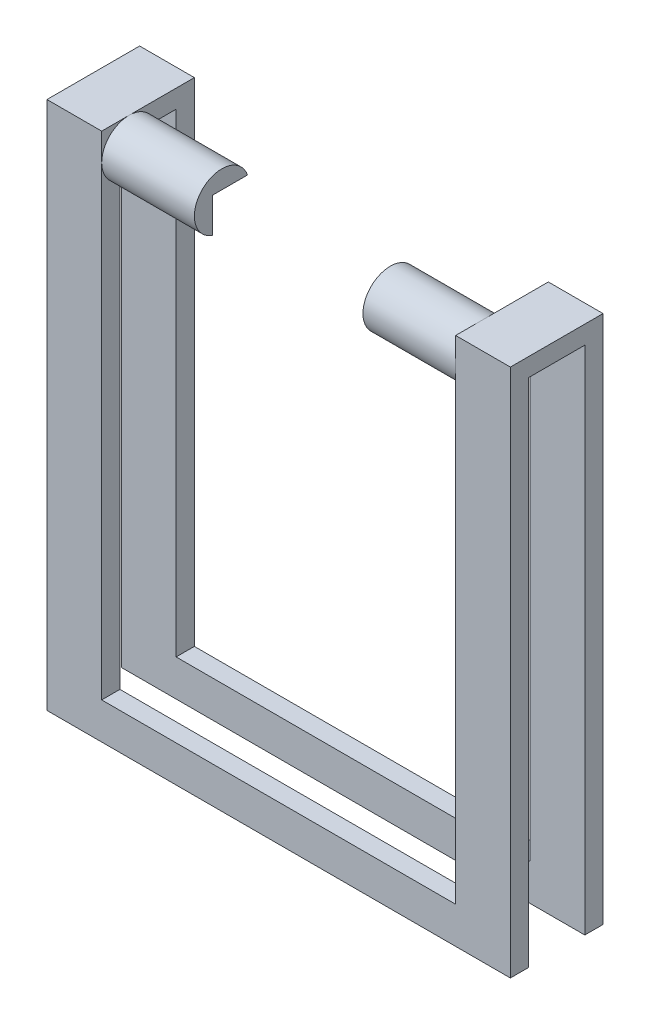
ISO-10303-21;
HEADER;
FILE_DESCRIPTION(('STEP AP214'),'2;1');
FILE_NAME('part.step','',(''),(''),'','','');
FILE_SCHEMA(('AUTOMOTIVE_DESIGN { 1 0 10303 214 1 1 1 1 }'));
ENDSEC;
DATA;
#1=APPLICATION_CONTEXT('core data for automotive mechanical design processes');
#2=APPLICATION_PROTOCOL_DEFINITION('international standard','automotive_design',2000,#1);
#3=PRODUCT_CONTEXT('',#1,'mechanical');
#4=PRODUCT('Part','Part','',(#3));
#5=PRODUCT_RELATED_PRODUCT_CATEGORY('part','',(#4));
#6=PRODUCT_DEFINITION_FORMATION('','',#4);
#7=PRODUCT_DEFINITION_CONTEXT('part definition',#1,'design');
#8=PRODUCT_DEFINITION('design','',#6,#7);
#9=PRODUCT_DEFINITION_SHAPE('','',#8);
#10=(LENGTH_UNIT() NAMED_UNIT(*) SI_UNIT(.MILLI.,.METRE.));
#11=(NAMED_UNIT(*) PLANE_ANGLE_UNIT() SI_UNIT($,.RADIAN.));
#12=(NAMED_UNIT(*) SI_UNIT($,.STERADIAN.) SOLID_ANGLE_UNIT());
#13=UNCERTAINTY_MEASURE_WITH_UNIT(LENGTH_MEASURE(1.E-05),#10,'distance_accuracy_value','');
#14=(GEOMETRIC_REPRESENTATION_CONTEXT(3) GLOBAL_UNCERTAINTY_ASSIGNED_CONTEXT((#13)) GLOBAL_UNIT_ASSIGNED_CONTEXT((#10,
#11,#12)) REPRESENTATION_CONTEXT('',''));
#15=CARTESIAN_POINT('',(0.,0.,0.));
#16=DIRECTION('',(0.,0.,1.));
#17=DIRECTION('',(1.,0.,0.));
#18=AXIS2_PLACEMENT_3D('',#15,#16,#17);
#19=CARTESIAN_POINT('',(0.,2.,0.));
#20=DIRECTION('',(0.,-1.,0.));
#21=DIRECTION('',(0.,0.,-1.));
#22=AXIS2_PLACEMENT_3D('',#19,#20,#21);
#23=PLANE('',#22);
#24=DIRECTION('',(0.,0.,1.));
#25=VECTOR('',#24,1.);
#26=CARTESIAN_POINT('',(-9.7,2.,-2.54));
#27=LINE('',#26,#25);
#28=CARTESIAN_POINT('',(-9.7,2.,-2.54));
#29=VERTEX_POINT('',#28);
#30=CARTESIAN_POINT('',(-9.7,2.,-1.54));
#31=VERTEX_POINT('',#30);
#32=EDGE_CURVE('E308',#29,#31,#27,.T.);
#33=ORIENTED_EDGE('',*,*,#32,.T.);
#34=DIRECTION('',(1.,0.,0.));
#35=VECTOR('',#34,1.);
#36=CARTESIAN_POINT('',(0.,2.,-1.54));
#37=LINE('',#36,#35);
#38=CARTESIAN_POINT('',(9.7,2.,-1.54));
#39=VERTEX_POINT('',#38);
#40=EDGE_CURVE('E291',#31,#39,#37,.T.);
#41=ORIENTED_EDGE('',*,*,#40,.T.);
#42=DIRECTION('',(0.,0.,1.));
#43=VECTOR('',#42,1.);
#44=CARTESIAN_POINT('',(9.7,2.,-2.54));
#45=LINE('',#44,#43);
#46=CARTESIAN_POINT('',(9.7,2.,-2.54));
#47=VERTEX_POINT('',#46);
#48=EDGE_CURVE('E339',#47,#39,#45,.T.);
#49=ORIENTED_EDGE('',*,*,#48,.F.);
#50=DIRECTION('',(-1.,0.,0.));
#51=VECTOR('',#50,1.);
#52=CARTESIAN_POINT('',(-12.7,2.,-2.54));
#53=LINE('',#52,#51);
#54=EDGE_CURVE('E221',#47,#29,#53,.T.);
#55=ORIENTED_EDGE('',*,*,#54,.T.);
#56=EDGE_LOOP('',(#33,#41,#49,#55));
#57=FACE_BOUND('',#56,.T.);
#58=ADVANCED_FACE('F33',(#57),#23,.F.);
#59=CARTESIAN_POINT('',(0.,0.,0.));
#60=DIRECTION('',(0.,-1.,0.));
#61=DIRECTION('',(0.,0.,-1.));
#62=AXIS2_PLACEMENT_3D('',#59,#60,#61);
#63=PLANE('',#62);
#64=DIRECTION('',(-1.,0.,0.));
#65=VECTOR('',#64,1.);
#66=CARTESIAN_POINT('',(12.7,0.,-1.54));
#67=LINE('',#66,#65);
#68=CARTESIAN_POINT('',(12.7,0.,-1.54));
#69=VERTEX_POINT('',#68);
#70=CARTESIAN_POINT('',(-12.7,0.,-1.54));
#71=VERTEX_POINT('',#70);
#72=EDGE_CURVE('E180',#69,#71,#67,.T.);
#73=ORIENTED_EDGE('',*,*,#72,.T.);
#74=DIRECTION('',(0.,0.,1.));
#75=VECTOR('',#74,1.);
#76=CARTESIAN_POINT('',(-12.7,0.,2.54));
#77=LINE('',#76,#75);
#78=CARTESIAN_POINT('',(-12.7,0.,-2.54));
#79=VERTEX_POINT('',#78);
#80=EDGE_CURVE('E217',#79,#71,#77,.T.);
#81=ORIENTED_EDGE('',*,*,#80,.F.);
#82=DIRECTION('',(-1.,0.,0.));
#83=VECTOR('',#82,1.);
#84=CARTESIAN_POINT('',(-12.7,0.,-2.54));
#85=LINE('',#84,#83);
#86=CARTESIAN_POINT('',(12.7,0.,-2.54));
#87=VERTEX_POINT('',#86);
#88=EDGE_CURVE('E202',#87,#79,#85,.T.);
#89=ORIENTED_EDGE('',*,*,#88,.F.);
#90=DIRECTION('',(0.,0.,-1.));
#91=VECTOR('',#90,1.);
#92=CARTESIAN_POINT('',(12.7,0.,2.54));
#93=LINE('',#92,#91);
#94=EDGE_CURVE('E197',#69,#87,#93,.T.);
#95=ORIENTED_EDGE('',*,*,#94,.F.);
#96=EDGE_LOOP('',(#73,#81,#89,#95));
#97=FACE_BOUND('',#96,.T.);
#98=ADVANCED_FACE('F201',(#97),#63,.T.);
#99=CARTESIAN_POINT('',(9.7,29.,-2.54));
#100=DIRECTION('',(1.,0.,0.));
#101=DIRECTION('',(0.,0.,-1.));
#102=AXIS2_PLACEMENT_3D('',#99,#100,#101);
#103=PLANE('',#102);
#104=ORIENTED_EDGE('',*,*,#48,.T.);
#105=DIRECTION('',(0.,1.,0.));
#106=VECTOR('',#105,1.);
#107=CARTESIAN_POINT('',(9.7,29.,-1.54));
#108=LINE('',#107,#106);
#109=CARTESIAN_POINT('',(9.7,28.,-1.54));
#110=VERTEX_POINT('',#109);
#111=EDGE_CURVE('E294',#39,#110,#108,.T.);
#112=ORIENTED_EDGE('',*,*,#111,.T.);
#113=DIRECTION('',(0.,0.,1.));
#114=VECTOR('',#113,1.);
#115=CARTESIAN_POINT('',(9.7,28.,-2.54));
#116=LINE('',#115,#114);
#117=CARTESIAN_POINT('',(9.7,28.,-0.374213562373096));
#118=VERTEX_POINT('',#117);
#119=EDGE_CURVE('E286',#110,#118,#116,.T.);
#120=ORIENTED_EDGE('',*,*,#119,.T.);
#121=CARTESIAN_POINT('',(9.7,27.5,1.04));
#122=DIRECTION('',(-1.,0.,0.));
#123=DIRECTION('',(0.,0.,1.));
#124=AXIS2_PLACEMENT_3D('',#121,#122,#123);
#125=CIRCLE('',#124,1.5);
#126=CARTESIAN_POINT('',(9.7,29.,1.04));
#127=VERTEX_POINT('',#126);
#128=EDGE_CURVE('E334',#127,#118,#125,.T.);
#129=ORIENTED_EDGE('',*,*,#128,.F.);
#130=DIRECTION('',(0.,0.,1.));
#131=VECTOR('',#130,1.);
#132=CARTESIAN_POINT('',(9.7,29.,-2.54));
#133=LINE('',#132,#131);
#134=CARTESIAN_POINT('',(9.7,29.,-2.54));
#135=VERTEX_POINT('',#134);
#136=EDGE_CURVE('E342',#135,#127,#133,.T.);
#137=ORIENTED_EDGE('',*,*,#136,.F.);
#138=DIRECTION('',(0.,-1.,0.));
#139=VECTOR('',#138,1.);
#140=CARTESIAN_POINT('',(9.7,29.,-2.54));
#141=LINE('',#140,#139);
#142=EDGE_CURVE('E205',#135,#47,#141,.T.);
#143=ORIENTED_EDGE('',*,*,#142,.T.);
#144=EDGE_LOOP('',(#104,#112,#120,#129,#137,#143));
#145=FACE_BOUND('',#144,.T.);
#146=ADVANCED_FACE('F403',(#145),#103,.F.);
#147=CARTESIAN_POINT('',(-9.7,29.,-2.54));
#148=DIRECTION('',(1.,0.,0.));
#149=DIRECTION('',(0.,0.,-1.));
#150=AXIS2_PLACEMENT_3D('',#147,#148,#149);
#151=PLANE('',#150);
#152=DIRECTION('',(0.,1.,0.));
#153=VECTOR('',#152,1.);
#154=CARTESIAN_POINT('',(-9.7,29.,-1.54));
#155=LINE('',#154,#153);
#156=CARTESIAN_POINT('',(-9.7,28.,-1.54));
#157=VERTEX_POINT('',#156);
#158=EDGE_CURVE('E11',#31,#157,#155,.T.);
#159=ORIENTED_EDGE('',*,*,#158,.F.);
#160=ORIENTED_EDGE('',*,*,#32,.F.);
#161=DIRECTION('',(0.,-1.,0.));
#162=VECTOR('',#161,1.);
#163=CARTESIAN_POINT('',(-9.7,29.,-2.54));
#164=LINE('',#163,#162);
#165=CARTESIAN_POINT('',(-9.7,29.,-2.54));
#166=VERTEX_POINT('',#165);
#167=EDGE_CURVE('E317',#166,#29,#164,.T.);
#168=ORIENTED_EDGE('',*,*,#167,.F.);
#169=DIRECTION('',(0.,0.,1.));
#170=VECTOR('',#169,1.);
#171=CARTESIAN_POINT('',(-9.7,29.,-2.54));
#172=LINE('',#171,#170);
#173=CARTESIAN_POINT('',(-9.7,29.,1.04));
#174=VERTEX_POINT('',#173);
#175=EDGE_CURVE('E312',#166,#174,#172,.T.);
#176=ORIENTED_EDGE('',*,*,#175,.T.);
#177=CARTESIAN_POINT('',(-9.7,27.5,1.04));
#178=DIRECTION('',(-1.,0.,0.));
#179=DIRECTION('',(0.,0.,1.));
#180=AXIS2_PLACEMENT_3D('',#177,#178,#179);
#181=CIRCLE('',#180,1.5);
#182=CARTESIAN_POINT('',(-9.7,28.,-0.374213562373096));
#183=VERTEX_POINT('',#182);
#184=EDGE_CURVE('E303',#174,#183,#181,.T.);
#185=ORIENTED_EDGE('',*,*,#184,.T.);
#186=DIRECTION('',(0.,0.,1.));
#187=VECTOR('',#186,1.);
#188=CARTESIAN_POINT('',(-9.7,28.,-2.54));
#189=LINE('',#188,#187);
#190=EDGE_CURVE('E279',#157,#183,#189,.T.);
#191=ORIENTED_EDGE('',*,*,#190,.F.);
#192=EDGE_LOOP('',(#159,#160,#168,#176,#185,#191));
#193=FACE_BOUND('',#192,.T.);
#194=ADVANCED_FACE('F407',(#193),#151,.T.);
#195=CARTESIAN_POINT('',(-9.7,27.5,2.54));
#196=VERTEX_POINT('',#195);
#197=EDGE_CURVE('E300',#196,#174,#181,.T.);
#198=ORIENTED_EDGE('',*,*,#197,.T.);
#199=CARTESIAN_POINT('',(-9.7,29.,2.54));
#200=VERTEX_POINT('',#199);
#201=EDGE_CURVE('E311',#174,#200,#172,.T.);
#202=ORIENTED_EDGE('',*,*,#201,.T.);
#203=DIRECTION('',(0.,-1.,0.));
#204=VECTOR('',#203,1.);
#205=CARTESIAN_POINT('',(-9.7,29.,2.54));
#206=LINE('',#205,#204);
#207=EDGE_CURVE('E323',#200,#196,#206,.T.);
#208=ORIENTED_EDGE('',*,*,#207,.T.);
#209=EDGE_LOOP('',(#198,#202,#208));
#210=FACE_BOUND('',#209,.T.);
#211=ADVANCED_FACE('F418',(#210),#151,.T.);
#212=CARTESIAN_POINT('',(9.7,27.5,2.54));
#213=VERTEX_POINT('',#212);
#214=EDGE_CURVE('E331',#213,#127,#125,.T.);
#215=ORIENTED_EDGE('',*,*,#214,.F.);
#216=DIRECTION('',(0.,-1.,0.));
#217=VECTOR('',#216,1.);
#218=CARTESIAN_POINT('',(9.7,29.,2.54));
#219=LINE('',#218,#217);
#220=CARTESIAN_POINT('',(9.7,29.,2.54));
#221=VERTEX_POINT('',#220);
#222=EDGE_CURVE('E209',#221,#213,#219,.T.);
#223=ORIENTED_EDGE('',*,*,#222,.F.);
#224=EDGE_CURVE('E341',#127,#221,#133,.T.);
#225=ORIENTED_EDGE('',*,*,#224,.F.);
#226=EDGE_LOOP('',(#215,#223,#225));
#227=FACE_BOUND('',#226,.T.);
#228=ADVANCED_FACE('F374',(#227),#103,.F.);
#229=CARTESIAN_POINT('',(9.7,2.,1.54));
#230=VERTEX_POINT('',#229);
#231=CARTESIAN_POINT('',(9.7,2.,2.54));
#232=VERTEX_POINT('',#231);
#233=EDGE_CURVE('E330',#230,#232,#45,.T.);
#234=ORIENTED_EDGE('',*,*,#233,.F.);
#235=DIRECTION('',(-1.,0.,0.));
#236=VECTOR('',#235,1.);
#237=CARTESIAN_POINT('',(0.,2.,1.54));
#238=LINE('',#237,#236);
#239=CARTESIAN_POINT('',(-9.7,2.,1.54));
#240=VERTEX_POINT('',#239);
#241=EDGE_CURVE('E259',#230,#240,#238,.T.);
#242=ORIENTED_EDGE('',*,*,#241,.T.);
#243=CARTESIAN_POINT('',(-9.7,2.,2.54));
#244=VERTEX_POINT('',#243);
#245=EDGE_CURVE('E299',#240,#244,#27,.T.);
#246=ORIENTED_EDGE('',*,*,#245,.T.);
#247=DIRECTION('',(1.,0.,0.));
#248=VECTOR('',#247,1.);
#249=CARTESIAN_POINT('',(-12.7,2.,2.54));
#250=LINE('',#249,#248);
#251=EDGE_CURVE('E213',#244,#232,#250,.T.);
#252=ORIENTED_EDGE('',*,*,#251,.T.);
#253=EDGE_LOOP('',(#234,#242,#246,#252));
#254=FACE_BOUND('',#253,.T.);
#255=ADVANCED_FACE('F359',(#254),#23,.F.);
#256=CARTESIAN_POINT('',(12.7,2.,2.54));
#257=DIRECTION('',(-1.,0.,0.));
#258=DIRECTION('',(0.,0.,1.));
#259=AXIS2_PLACEMENT_3D('',#256,#257,#258);
#260=PLANE('',#259);
#261=DIRECTION('',(0.,0.,-1.));
#262=VECTOR('',#261,1.);
#263=CARTESIAN_POINT('',(12.7,28.,1.54));
#264=LINE('',#263,#262);
#265=CARTESIAN_POINT('',(12.7,28.,1.54));
#266=VERTEX_POINT('',#265);
#267=CARTESIAN_POINT('',(12.7,28.,-1.54));
#268=VERTEX_POINT('',#267);
#269=EDGE_CURVE('E194',#266,#268,#264,.T.);
#270=ORIENTED_EDGE('',*,*,#269,.T.);
#271=DIRECTION('',(0.,-1.,0.));
#272=VECTOR('',#271,1.);
#273=CARTESIAN_POINT('',(12.7,28.,-1.54));
#274=LINE('',#273,#272);
#275=EDGE_CURVE('E184',#268,#69,#274,.T.);
#276=ORIENTED_EDGE('',*,*,#275,.T.);
#277=ORIENTED_EDGE('',*,*,#94,.T.);
#278=DIRECTION('',(0.,-1.,0.));
#279=VECTOR('',#278,1.);
#280=CARTESIAN_POINT('',(12.7,2.,-2.54));
#281=LINE('',#280,#279);
#282=CARTESIAN_POINT('',(12.7,29.,-2.54));
#283=VERTEX_POINT('',#282);
#284=EDGE_CURVE('E231',#283,#87,#281,.T.);
#285=ORIENTED_EDGE('',*,*,#284,.F.);
#286=DIRECTION('',(0.,0.,-1.));
#287=VECTOR('',#286,1.);
#288=CARTESIAN_POINT('',(12.7,29.,-2.54));
#289=LINE('',#288,#287);
#290=CARTESIAN_POINT('',(12.7,29.,2.54));
#291=VERTEX_POINT('',#290);
#292=EDGE_CURVE('E335',#291,#283,#289,.T.);
#293=ORIENTED_EDGE('',*,*,#292,.F.);
#294=DIRECTION('',(0.,-1.,0.));
#295=VECTOR('',#294,1.);
#296=CARTESIAN_POINT('',(12.7,2.,2.54));
#297=LINE('',#296,#295);
#298=CARTESIAN_POINT('',(12.7,0.,2.54));
#299=VERTEX_POINT('',#298);
#300=EDGE_CURVE('E222',#291,#299,#297,.T.);
#301=ORIENTED_EDGE('',*,*,#300,.T.);
#302=CARTESIAN_POINT('',(12.7,0.,1.54));
#303=VERTEX_POINT('',#302);
#304=EDGE_CURVE('E204',#299,#303,#93,.T.);
#305=ORIENTED_EDGE('',*,*,#304,.T.);
#306=DIRECTION('',(0.,1.,0.));
#307=VECTOR('',#306,1.);
#308=CARTESIAN_POINT('',(12.7,0.,1.54));
#309=LINE('',#308,#307);
#310=EDGE_CURVE('E48',#303,#266,#309,.T.);
#311=ORIENTED_EDGE('',*,*,#310,.T.);
#312=EDGE_LOOP('',(#270,#276,#277,#285,#293,#301,#305,#311));
#313=FACE_BOUND('',#312,.T.);
#314=ADVANCED_FACE('F35',(#313),#260,.F.);
#315=CARTESIAN_POINT('',(-12.7,2.,-2.54));
#316=DIRECTION('',(0.,0.,1.));
#317=DIRECTION('',(1.,0.,0.));
#318=AXIS2_PLACEMENT_3D('',#315,#316,#317);
#319=PLANE('',#318);
#320=ORIENTED_EDGE('',*,*,#88,.T.);
#321=DIRECTION('',(0.,-1.,0.));
#322=VECTOR('',#321,1.);
#323=CARTESIAN_POINT('',(-12.7,2.,-2.54));
#324=LINE('',#323,#322);
#325=CARTESIAN_POINT('',(-12.7,29.,-2.54));
#326=VERTEX_POINT('',#325);
#327=EDGE_CURVE('E228',#326,#79,#324,.T.);
#328=ORIENTED_EDGE('',*,*,#327,.F.);
#329=DIRECTION('',(1.,0.,0.));
#330=VECTOR('',#329,1.);
#331=CARTESIAN_POINT('',(-12.7,29.,-2.54));
#332=LINE('',#331,#330);
#333=EDGE_CURVE('E314',#326,#166,#332,.T.);
#334=ORIENTED_EDGE('',*,*,#333,.T.);
#335=ORIENTED_EDGE('',*,*,#167,.T.);
#336=ORIENTED_EDGE('',*,*,#54,.F.);
#337=ORIENTED_EDGE('',*,*,#142,.F.);
#338=DIRECTION('',(-1.,0.,0.));
#339=VECTOR('',#338,1.);
#340=CARTESIAN_POINT('',(12.7,29.,-2.54));
#341=LINE('',#340,#339);
#342=EDGE_CURVE('E338',#283,#135,#341,.T.);
#343=ORIENTED_EDGE('',*,*,#342,.F.);
#344=ORIENTED_EDGE('',*,*,#284,.T.);
#345=EDGE_LOOP('',(#320,#328,#334,#335,#336,#337,#343,#344));
#346=FACE_BOUND('',#345,.T.);
#347=ADVANCED_FACE('F424',(#346),#319,.F.);
#348=CARTESIAN_POINT('',(-12.7,2.,2.54));
#349=DIRECTION('',(1.,0.,0.));
#350=DIRECTION('',(0.,0.,-1.));
#351=AXIS2_PLACEMENT_3D('',#348,#349,#350);
#352=PLANE('',#351);
#353=ORIENTED_EDGE('',*,*,#80,.T.);
#354=DIRECTION('',(0.,1.,0.));
#355=VECTOR('',#354,1.);
#356=CARTESIAN_POINT('',(-12.7,2.,-1.54));
#357=LINE('',#356,#355);
#358=CARTESIAN_POINT('',(-12.7,28.,-1.54));
#359=VERTEX_POINT('',#358);
#360=EDGE_CURVE('E188',#71,#359,#357,.T.);
#361=ORIENTED_EDGE('',*,*,#360,.T.);
#362=DIRECTION('',(0.,0.,1.));
#363=VECTOR('',#362,1.);
#364=CARTESIAN_POINT('',(-12.7,28.,2.54));
#365=LINE('',#364,#363);
#366=CARTESIAN_POINT('',(-12.7,28.,1.54));
#367=VERTEX_POINT('',#366);
#368=EDGE_CURVE('E289',#359,#367,#365,.T.);
#369=ORIENTED_EDGE('',*,*,#368,.T.);
#370=DIRECTION('',(0.,-1.,0.));
#371=VECTOR('',#370,1.);
#372=CARTESIAN_POINT('',(-12.7,2.,1.54));
#373=LINE('',#372,#371);
#374=CARTESIAN_POINT('',(-12.7,0.,1.54));
#375=VERTEX_POINT('',#374);
#376=EDGE_CURVE('E275',#367,#375,#373,.T.);
#377=ORIENTED_EDGE('',*,*,#376,.T.);
#378=CARTESIAN_POINT('',(-12.7,0.,2.54));
#379=VERTEX_POINT('',#378);
#380=EDGE_CURVE('E216',#375,#379,#77,.T.);
#381=ORIENTED_EDGE('',*,*,#380,.T.);
#382=DIRECTION('',(0.,-1.,0.));
#383=VECTOR('',#382,1.);
#384=CARTESIAN_POINT('',(-12.7,2.,2.54));
#385=LINE('',#384,#383);
#386=CARTESIAN_POINT('',(-12.7,29.,2.54));
#387=VERTEX_POINT('',#386);
#388=EDGE_CURVE('E225',#387,#379,#385,.T.);
#389=ORIENTED_EDGE('',*,*,#388,.F.);
#390=DIRECTION('',(0.,0.,-1.));
#391=VECTOR('',#390,1.);
#392=CARTESIAN_POINT('',(-12.7,29.,-2.54));
#393=LINE('',#392,#391);
#394=EDGE_CURVE('E304',#387,#326,#393,.T.);
#395=ORIENTED_EDGE('',*,*,#394,.T.);
#396=ORIENTED_EDGE('',*,*,#327,.T.);
#397=EDGE_LOOP('',(#353,#361,#369,#377,#381,#389,#395,#396));
#398=FACE_BOUND('',#397,.T.);
#399=ADVANCED_FACE('F393',(#398),#352,.F.);
#400=CARTESIAN_POINT('',(-12.7,2.,2.54));
#401=DIRECTION('',(0.,0.,-1.));
#402=DIRECTION('',(-1.,0.,0.));
#403=AXIS2_PLACEMENT_3D('',#400,#401,#402);
#404=PLANE('',#403);
#405=DIRECTION('',(1.,0.,0.));
#406=VECTOR('',#405,1.);
#407=CARTESIAN_POINT('',(-12.7,0.,2.54));
#408=LINE('',#407,#406);
#409=EDGE_CURVE('E219',#379,#299,#408,.T.);
#410=ORIENTED_EDGE('',*,*,#409,.T.);
#411=ORIENTED_EDGE('',*,*,#300,.F.);
#412=DIRECTION('',(1.,0.,0.));
#413=VECTOR('',#412,1.);
#414=CARTESIAN_POINT('',(12.7,29.,2.54));
#415=LINE('',#414,#413);
#416=EDGE_CURVE('E345',#221,#291,#415,.T.);
#417=ORIENTED_EDGE('',*,*,#416,.F.);
#418=ORIENTED_EDGE('',*,*,#222,.T.);
#419=EDGE_CURVE('E348',#213,#232,#219,.T.);
#420=ORIENTED_EDGE('',*,*,#419,.T.);
#421=ORIENTED_EDGE('',*,*,#251,.F.);
#422=EDGE_CURVE('E322',#196,#244,#206,.T.);
#423=ORIENTED_EDGE('',*,*,#422,.F.);
#424=ORIENTED_EDGE('',*,*,#207,.F.);
#425=DIRECTION('',(-1.,0.,0.));
#426=VECTOR('',#425,1.);
#427=CARTESIAN_POINT('',(-12.7,29.,2.54));
#428=LINE('',#427,#426);
#429=EDGE_CURVE('E307',#200,#387,#428,.T.);
#430=ORIENTED_EDGE('',*,*,#429,.T.);
#431=ORIENTED_EDGE('',*,*,#388,.T.);
#432=EDGE_LOOP('',(#410,#411,#417,#418,#420,#421,#423,#424,#430,#431));
#433=FACE_BOUND('',#432,.T.);
#434=ADVANCED_FACE('F365',(#433),#404,.F.);
#435=DIRECTION('',(-1.,0.,0.));
#436=VECTOR('',#435,1.);
#437=CARTESIAN_POINT('',(12.7,0.,1.54));
#438=LINE('',#437,#436);
#439=EDGE_CURVE('E193',#303,#375,#438,.T.);
#440=ORIENTED_EDGE('',*,*,#439,.F.);
#441=ORIENTED_EDGE('',*,*,#304,.F.);
#442=ORIENTED_EDGE('',*,*,#409,.F.);
#443=ORIENTED_EDGE('',*,*,#380,.F.);
#444=EDGE_LOOP('',(#440,#441,#442,#443));
#445=FACE_BOUND('',#444,.T.);
#446=ADVANCED_FACE('F395',(#445),#63,.T.);
#447=CARTESIAN_POINT('',(9.7,26.0857864376269,1.54));
#448=VERTEX_POINT('',#447);
#449=EDGE_CURVE('E326',#448,#213,#125,.T.);
#450=ORIENTED_EDGE('',*,*,#449,.F.);
#451=DIRECTION('',(0.,-1.,0.));
#452=VECTOR('',#451,1.);
#453=CARTESIAN_POINT('',(9.7,29.,1.54));
#454=LINE('',#453,#452);
#455=EDGE_CURVE('E267',#448,#230,#454,.T.);
#456=ORIENTED_EDGE('',*,*,#455,.T.);
#457=ORIENTED_EDGE('',*,*,#233,.T.);
#458=ORIENTED_EDGE('',*,*,#419,.F.);
#459=EDGE_LOOP('',(#450,#456,#457,#458));
#460=FACE_BOUND('',#459,.T.);
#461=ADVANCED_FACE('F371',(#460),#103,.F.);
#462=CARTESIAN_POINT('',(0.,29.,0.));
#463=DIRECTION('',(0.,-1.,0.));
#464=DIRECTION('',(0.,0.,-1.));
#465=AXIS2_PLACEMENT_3D('',#462,#463,#464);
#466=PLANE('',#465);
#467=ORIENTED_EDGE('',*,*,#292,.T.);
#468=ORIENTED_EDGE('',*,*,#342,.T.);
#469=ORIENTED_EDGE('',*,*,#136,.T.);
#470=ORIENTED_EDGE('',*,*,#224,.T.);
#471=ORIENTED_EDGE('',*,*,#416,.T.);
#472=EDGE_LOOP('',(#467,#468,#469,#470,#471));
#473=FACE_BOUND('',#472,.T.);
#474=ADVANCED_FACE('F399',(#473),#466,.F.);
#475=CARTESIAN_POINT('',(4.62,27.5,1.04));
#476=DIRECTION('',(1.,0.,0.));
#477=DIRECTION('',(0.,0.,-1.));
#478=AXIS2_PLACEMENT_3D('',#475,#476,#477);
#479=CYLINDRICAL_SURFACE('',#478,1.5);
#480=ORIENTED_EDGE('',*,*,#128,.T.);
#481=DIRECTION('',(1.,0.,0.));
#482=VECTOR('',#481,1.);
#483=CARTESIAN_POINT('',(4.62,28.,-0.374213562373099));
#484=LINE('',#483,#482);
#485=CARTESIAN_POINT('',(4.62,28.,-0.374213562373099));
#486=VERTEX_POINT('',#485);
#487=EDGE_CURVE('E283',#118,#486,#484,.F.);
#488=ORIENTED_EDGE('',*,*,#487,.T.);
#489=CARTESIAN_POINT('',(4.62,27.5,1.04));
#490=DIRECTION('',(-1.,0.,0.));
#491=DIRECTION('',(0.,0.,1.));
#492=AXIS2_PLACEMENT_3D('',#489,#490,#491);
#493=CIRCLE('',#492,1.5);
#494=CARTESIAN_POINT('',(4.62,26.0857864376269,1.54));
#495=VERTEX_POINT('',#494);
#496=EDGE_CURVE('E327',#495,#486,#493,.T.);
#497=ORIENTED_EDGE('',*,*,#496,.F.);
#498=DIRECTION('',(1.,0.,0.));
#499=VECTOR('',#498,1.);
#500=CARTESIAN_POINT('',(4.62,26.0857864376269,1.54));
#501=LINE('',#500,#499);
#502=EDGE_CURVE('E270',#495,#448,#501,.T.);
#503=ORIENTED_EDGE('',*,*,#502,.T.);
#504=ORIENTED_EDGE('',*,*,#449,.T.);
#505=ORIENTED_EDGE('',*,*,#214,.T.);
#506=EDGE_LOOP('',(#480,#488,#497,#503,#504,#505));
#507=FACE_BOUND('',#506,.T.);
#508=ADVANCED_FACE('F377',(#507),#479,.T.);
#509=CARTESIAN_POINT('',(4.62,27.5,1.04));
#510=DIRECTION('',(-1.,0.,0.));
#511=DIRECTION('',(0.,0.,1.));
#512=AXIS2_PLACEMENT_3D('',#509,#510,#511);
#513=PLANE('',#512);
#514=DIRECTION('',(0.,0.,-1.));
#515=VECTOR('',#514,1.);
#516=CARTESIAN_POINT('',(4.62,28.,1.04));
#517=LINE('',#516,#515);
#518=CARTESIAN_POINT('',(4.62,28.,1.54));
#519=VERTEX_POINT('',#518);
#520=EDGE_CURVE('E281',#519,#486,#517,.T.);
#521=ORIENTED_EDGE('',*,*,#520,.F.);
#522=DIRECTION('',(0.,1.,0.));
#523=VECTOR('',#522,1.);
#524=CARTESIAN_POINT('',(4.62,27.5,1.54));
#525=LINE('',#524,#523);
#526=EDGE_CURVE('E273',#495,#519,#525,.T.);
#527=ORIENTED_EDGE('',*,*,#526,.F.);
#528=ORIENTED_EDGE('',*,*,#496,.T.);
#529=EDGE_LOOP('',(#521,#527,#528));
#530=FACE_BOUND('',#529,.T.);
#531=ADVANCED_FACE('F383',(#530),#513,.T.);
#532=DIRECTION('',(0.,-1.,0.));
#533=VECTOR('',#532,1.);
#534=CARTESIAN_POINT('',(-9.7,29.,1.54));
#535=LINE('',#534,#533);
#536=CARTESIAN_POINT('',(-9.7,26.0857864376269,1.54));
#537=VERTEX_POINT('',#536);
#538=EDGE_CURVE('E256',#537,#240,#535,.T.);
#539=ORIENTED_EDGE('',*,*,#538,.F.);
#540=EDGE_CURVE('E255',#537,#196,#181,.T.);
#541=ORIENTED_EDGE('',*,*,#540,.T.);
#542=ORIENTED_EDGE('',*,*,#422,.T.);
#543=ORIENTED_EDGE('',*,*,#245,.F.);
#544=EDGE_LOOP('',(#539,#541,#542,#543));
#545=FACE_BOUND('',#544,.T.);
#546=ADVANCED_FACE('F414',(#545),#151,.T.);
#547=CARTESIAN_POINT('',(0.,29.,0.));
#548=DIRECTION('',(0.,-1.,0.));
#549=DIRECTION('',(0.,0.,-1.));
#550=AXIS2_PLACEMENT_3D('',#547,#548,#549);
#551=PLANE('',#550);
#552=ORIENTED_EDGE('',*,*,#394,.F.);
#553=ORIENTED_EDGE('',*,*,#429,.F.);
#554=ORIENTED_EDGE('',*,*,#201,.F.);
#555=ORIENTED_EDGE('',*,*,#175,.F.);
#556=ORIENTED_EDGE('',*,*,#333,.F.);
#557=EDGE_LOOP('',(#552,#553,#554,#555,#556));
#558=FACE_BOUND('',#557,.T.);
#559=ADVANCED_FACE('F421',(#558),#551,.F.);
#560=CARTESIAN_POINT('',(-4.62,27.5,1.04));
#561=DIRECTION('',(-1.,0.,0.));
#562=DIRECTION('',(0.,0.,1.));
#563=AXIS2_PLACEMENT_3D('',#560,#561,#562);
#564=CYLINDRICAL_SURFACE('',#563,1.5);
#565=DIRECTION('',(-1.,0.,0.));
#566=VECTOR('',#565,1.);
#567=CARTESIAN_POINT('',(-4.62,28.,-0.374213562373099));
#568=LINE('',#567,#566);
#569=CARTESIAN_POINT('',(-4.62,28.,-0.374213562373099));
#570=VERTEX_POINT('',#569);
#571=EDGE_CURVE('E241',#183,#570,#568,.F.);
#572=ORIENTED_EDGE('',*,*,#571,.F.);
#573=ORIENTED_EDGE('',*,*,#184,.F.);
#574=ORIENTED_EDGE('',*,*,#197,.F.);
#575=ORIENTED_EDGE('',*,*,#540,.F.);
#576=DIRECTION('',(-1.,0.,0.));
#577=VECTOR('',#576,1.);
#578=CARTESIAN_POINT('',(-4.62,26.0857864376269,1.54));
#579=LINE('',#578,#577);
#580=CARTESIAN_POINT('',(-4.62,26.0857864376269,1.54));
#581=VERTEX_POINT('',#580);
#582=EDGE_CURVE('E249',#581,#537,#579,.T.);
#583=ORIENTED_EDGE('',*,*,#582,.F.);
#584=CARTESIAN_POINT('',(-4.62,27.5,1.04));
#585=DIRECTION('',(-1.,0.,0.));
#586=DIRECTION('',(0.,0.,1.));
#587=AXIS2_PLACEMENT_3D('',#584,#585,#586);
#588=CIRCLE('',#587,1.5);
#589=EDGE_CURVE('E246',#581,#570,#588,.T.);
#590=ORIENTED_EDGE('',*,*,#589,.T.);
#591=EDGE_LOOP('',(#572,#573,#574,#575,#583,#590));
#592=FACE_BOUND('',#591,.T.);
#593=ADVANCED_FACE('F253',(#592),#564,.T.);
#594=CARTESIAN_POINT('',(-4.62,27.5,1.04));
#595=DIRECTION('',(1.,0.,0.));
#596=DIRECTION('',(0.,0.,1.));
#597=AXIS2_PLACEMENT_3D('',#594,#595,#596);
#598=PLANE('',#597);
#599=DIRECTION('',(0.,0.,1.));
#600=VECTOR('',#599,1.);
#601=CARTESIAN_POINT('',(-4.62,28.,1.04));
#602=LINE('',#601,#600);
#603=CARTESIAN_POINT('',(-4.62,28.,1.54));
#604=VERTEX_POINT('',#603);
#605=EDGE_CURVE('E41',#570,#604,#602,.T.);
#606=ORIENTED_EDGE('',*,*,#605,.F.);
#607=ORIENTED_EDGE('',*,*,#589,.F.);
#608=DIRECTION('',(0.,-1.,0.));
#609=VECTOR('',#608,1.);
#610=CARTESIAN_POINT('',(-4.62,27.5,1.54));
#611=LINE('',#610,#609);
#612=EDGE_CURVE('E233',#604,#581,#611,.T.);
#613=ORIENTED_EDGE('',*,*,#612,.F.);
#614=EDGE_LOOP('',(#606,#607,#613));
#615=FACE_BOUND('',#614,.T.);
#616=ADVANCED_FACE('F245',(#615),#598,.T.);
#617=CARTESIAN_POINT('',(12.7,28.,-1.54));
#618=DIRECTION('',(0.,0.,-1.));
#619=DIRECTION('',(-1.,0.,0.));
#620=AXIS2_PLACEMENT_3D('',#617,#618,#619);
#621=PLANE('',#620);
#622=ORIENTED_EDGE('',*,*,#72,.F.);
#623=ORIENTED_EDGE('',*,*,#275,.F.);
#624=DIRECTION('',(-1.,0.,0.));
#625=VECTOR('',#624,1.);
#626=CARTESIAN_POINT('',(12.7,28.,-1.54));
#627=LINE('',#626,#625);
#628=EDGE_CURVE('E257',#268,#110,#627,.T.);
#629=ORIENTED_EDGE('',*,*,#628,.T.);
#630=ORIENTED_EDGE('',*,*,#111,.F.);
#631=ORIENTED_EDGE('',*,*,#40,.F.);
#632=ORIENTED_EDGE('',*,*,#158,.T.);
#633=EDGE_CURVE('E261',#157,#359,#627,.T.);
#634=ORIENTED_EDGE('',*,*,#633,.T.);
#635=ORIENTED_EDGE('',*,*,#360,.F.);
#636=EDGE_LOOP('',(#622,#623,#629,#630,#631,#632,#634,#635));
#637=FACE_BOUND('',#636,.T.);
#638=ADVANCED_FACE('F182',(#637),#621,.F.);
#639=CARTESIAN_POINT('',(12.7,28.,1.54));
#640=DIRECTION('',(0.,1.,0.));
#641=DIRECTION('',(0.,0.,1.));
#642=AXIS2_PLACEMENT_3D('',#639,#640,#641);
#643=PLANE('',#642);
#644=ORIENTED_EDGE('',*,*,#633,.F.);
#645=ORIENTED_EDGE('',*,*,#190,.T.);
#646=ORIENTED_EDGE('',*,*,#571,.T.);
#647=ORIENTED_EDGE('',*,*,#605,.T.);
#648=DIRECTION('',(-1.,0.,0.));
#649=VECTOR('',#648,1.);
#650=CARTESIAN_POINT('',(12.7,28.,1.54));
#651=LINE('',#650,#649);
#652=EDGE_CURVE('E55',#604,#367,#651,.T.);
#653=ORIENTED_EDGE('',*,*,#652,.T.);
#654=ORIENTED_EDGE('',*,*,#368,.F.);
#655=EDGE_LOOP('',(#644,#645,#646,#647,#653,#654));
#656=FACE_BOUND('',#655,.T.);
#657=ADVANCED_FACE('F238',(#656),#643,.F.);
#658=ORIENTED_EDGE('',*,*,#628,.F.);
#659=ORIENTED_EDGE('',*,*,#269,.F.);
#660=EDGE_CURVE('E386',#266,#519,#651,.T.);
#661=ORIENTED_EDGE('',*,*,#660,.T.);
#662=ORIENTED_EDGE('',*,*,#520,.T.);
#663=ORIENTED_EDGE('',*,*,#487,.F.);
#664=ORIENTED_EDGE('',*,*,#119,.F.);
#665=EDGE_LOOP('',(#658,#659,#661,#662,#663,#664));
#666=FACE_BOUND('',#665,.T.);
#667=ADVANCED_FACE('F385',(#666),#643,.F.);
#668=CARTESIAN_POINT('',(12.7,0.,1.54));
#669=DIRECTION('',(0.,0.,1.));
#670=DIRECTION('',(1.,0.,0.));
#671=AXIS2_PLACEMENT_3D('',#668,#669,#670);
#672=PLANE('',#671);
#673=ORIENTED_EDGE('',*,*,#652,.F.);
#674=ORIENTED_EDGE('',*,*,#612,.T.);
#675=ORIENTED_EDGE('',*,*,#582,.T.);
#676=ORIENTED_EDGE('',*,*,#538,.T.);
#677=ORIENTED_EDGE('',*,*,#241,.F.);
#678=ORIENTED_EDGE('',*,*,#455,.F.);
#679=ORIENTED_EDGE('',*,*,#502,.F.);
#680=ORIENTED_EDGE('',*,*,#526,.T.);
#681=ORIENTED_EDGE('',*,*,#660,.F.);
#682=ORIENTED_EDGE('',*,*,#310,.F.);
#683=ORIENTED_EDGE('',*,*,#439,.T.);
#684=ORIENTED_EDGE('',*,*,#376,.F.);
#685=EDGE_LOOP('',(#673,#674,#675,#676,#677,#678,#679,#680,#681,#682,#683,#684));
#686=FACE_BOUND('',#685,.T.);
#687=ADVANCED_FACE('F248',(#686),#672,.F.);
#688=CLOSED_SHELL('',(#58,#98,#146,#194,#211,#228,#255,#314,#347,#399,#434,#446,#461,#474,#508,
#531,#546,#559,#593,#616,#638,#657,#667,#687));
#689=MANIFOLD_SOLID_BREP('B2',#688);
#690=ADVANCED_BREP_SHAPE_REPRESENTATION('',(#18,#689),#14);
#691=SHAPE_DEFINITION_REPRESENTATION(#9,#690);
ENDSEC;
END-ISO-10303-21;
